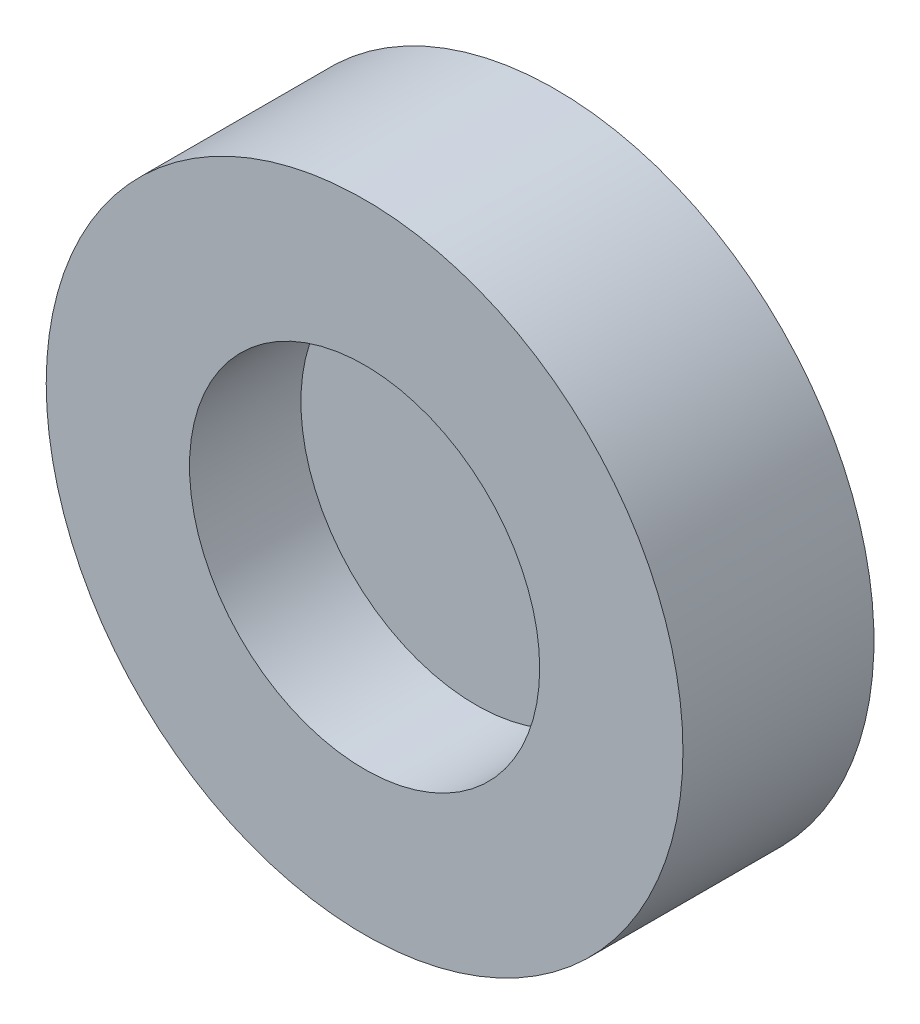
ISO-10303-21;
HEADER;
FILE_DESCRIPTION(('STEP AP214'),'2;1');
FILE_NAME('part.step','',(''),(''),'','','');
FILE_SCHEMA(('AUTOMOTIVE_DESIGN { 1 0 10303 214 1 1 1 1 }'));
ENDSEC;
DATA;
#1=APPLICATION_CONTEXT('core data for automotive mechanical design processes');
#2=APPLICATION_PROTOCOL_DEFINITION('international standard','automotive_design',2000,#1);
#3=PRODUCT_CONTEXT('',#1,'mechanical');
#4=PRODUCT('Part','Part','',(#3));
#5=PRODUCT_RELATED_PRODUCT_CATEGORY('part','',(#4));
#6=PRODUCT_DEFINITION_FORMATION('','',#4);
#7=PRODUCT_DEFINITION_CONTEXT('part definition',#1,'design');
#8=PRODUCT_DEFINITION('design','',#6,#7);
#9=PRODUCT_DEFINITION_SHAPE('','',#8);
#10=(LENGTH_UNIT() NAMED_UNIT(*) SI_UNIT(.MILLI.,.METRE.));
#11=(NAMED_UNIT(*) PLANE_ANGLE_UNIT() SI_UNIT($,.RADIAN.));
#12=(NAMED_UNIT(*) SI_UNIT($,.STERADIAN.) SOLID_ANGLE_UNIT());
#13=UNCERTAINTY_MEASURE_WITH_UNIT(LENGTH_MEASURE(1.E-05),#10,'distance_accuracy_value','');
#14=(GEOMETRIC_REPRESENTATION_CONTEXT(3) GLOBAL_UNCERTAINTY_ASSIGNED_CONTEXT((#13)) GLOBAL_UNIT_ASSIGNED_CONTEXT((#10,
#11,#12)) REPRESENTATION_CONTEXT('',''));
#15=CARTESIAN_POINT('',(0.,0.,0.));
#16=DIRECTION('',(0.,0.,1.));
#17=DIRECTION('',(1.,0.,0.));
#18=AXIS2_PLACEMENT_3D('',#15,#16,#17);
#19=CARTESIAN_POINT('',(0.,0.,7.));
#20=DIRECTION('',(0.,0.,1.));
#21=DIRECTION('',(1.,0.,0.));
#22=AXIS2_PLACEMENT_3D('',#19,#20,#21);
#23=PLANE('',#22);
#24=CARTESIAN_POINT('',(0.,0.,7.));
#25=DIRECTION('',(0.,0.,1.));
#26=DIRECTION('',(1.,0.,0.));
#27=AXIS2_PLACEMENT_3D('',#24,#25,#26);
#28=CIRCLE('',#27,20.);
#29=CARTESIAN_POINT('',(20.,0.,7.));
#30=VERTEX_POINT('',#29);
#31=EDGE_CURVE('E10',#30,#30,#28,.T.);
#32=ORIENTED_EDGE('',*,*,#31,.T.);
#33=EDGE_LOOP('',(#32));
#34=FACE_BOUND('',#33,.T.);
#35=CARTESIAN_POINT('',(0.,0.,7.));
#36=DIRECTION('',(0.,0.,1.));
#37=DIRECTION('',(1.,0.,0.));
#38=AXIS2_PLACEMENT_3D('',#35,#36,#37);
#39=CIRCLE('',#38,11.);
#40=CARTESIAN_POINT('',(11.,0.,7.));
#41=VERTEX_POINT('',#40);
#42=EDGE_CURVE('E45',#41,#41,#39,.T.);
#43=ORIENTED_EDGE('',*,*,#42,.F.);
#44=EDGE_LOOP('',(#43));
#45=FACE_BOUND('',#44,.T.);
#46=ADVANCED_FACE('F37',(#34,#45),#23,.T.);
#47=CARTESIAN_POINT('',(0.,0.,7.));
#48=DIRECTION('',(0.,0.,-1.));
#49=DIRECTION('',(-1.,0.,0.));
#50=AXIS2_PLACEMENT_3D('',#47,#48,#49);
#51=CYLINDRICAL_SURFACE('',#50,20.);
#52=ORIENTED_EDGE('',*,*,#31,.F.);
#53=EDGE_LOOP('',(#52));
#54=FACE_BOUND('',#53,.T.);
#55=CARTESIAN_POINT('',(0.,0.,-5.));
#56=DIRECTION('',(0.,0.,-1.));
#57=DIRECTION('',(-1.,0.,0.));
#58=AXIS2_PLACEMENT_3D('',#55,#56,#57);
#59=CIRCLE('',#58,20.);
#60=CARTESIAN_POINT('',(-20.,0.,-5.));
#61=VERTEX_POINT('',#60);
#62=EDGE_CURVE('E56',#61,#61,#59,.T.);
#63=ORIENTED_EDGE('',*,*,#62,.F.);
#64=EDGE_LOOP('',(#63));
#65=FACE_BOUND('',#64,.T.);
#66=ADVANCED_FACE('F39',(#54,#65),#51,.T.);
#67=CARTESIAN_POINT('',(0.,0.,7.));
#68=DIRECTION('',(0.,0.,-1.));
#69=DIRECTION('',(-1.,0.,0.));
#70=AXIS2_PLACEMENT_3D('',#67,#68,#69);
#71=CYLINDRICAL_SURFACE('',#70,11.);
#72=ORIENTED_EDGE('',*,*,#42,.T.);
#73=EDGE_LOOP('',(#72));
#74=FACE_BOUND('',#73,.T.);
#75=CARTESIAN_POINT('',(0.,0.,0.));
#76=DIRECTION('',(0.,0.,1.));
#77=DIRECTION('',(1.,0.,0.));
#78=AXIS2_PLACEMENT_3D('',#75,#76,#77);
#79=CIRCLE('',#78,11.);
#80=CARTESIAN_POINT('',(11.,0.,0.));
#81=VERTEX_POINT('',#80);
#82=EDGE_CURVE('E50',#81,#81,#79,.T.);
#83=ORIENTED_EDGE('',*,*,#82,.F.);
#84=EDGE_LOOP('',(#83));
#85=FACE_BOUND('',#84,.T.);
#86=ADVANCED_FACE('F65',(#74,#85),#71,.F.);
#87=CARTESIAN_POINT('',(0.,0.,0.));
#88=DIRECTION('',(0.,0.,-1.));
#89=DIRECTION('',(-1.,0.,0.));
#90=AXIS2_PLACEMENT_3D('',#87,#88,#89);
#91=PLANE('',#90);
#92=ORIENTED_EDGE('',*,*,#82,.T.);
#93=EDGE_LOOP('',(#92));
#94=FACE_BOUND('',#93,.T.);
#95=ADVANCED_FACE('F71',(#94),#91,.F.);
#96=CARTESIAN_POINT('',(0.,0.,-5.));
#97=DIRECTION('',(0.,0.,-1.));
#98=DIRECTION('',(-1.,0.,0.));
#99=AXIS2_PLACEMENT_3D('',#96,#97,#98);
#100=PLANE('',#99);
#101=ORIENTED_EDGE('',*,*,#62,.T.);
#102=EDGE_LOOP('',(#101));
#103=FACE_BOUND('',#102,.T.);
#104=ADVANCED_FACE('F62',(#103),#100,.T.);
#105=CLOSED_SHELL('',(#46,#66,#86,#95,#104));
#106=MANIFOLD_SOLID_BREP('B2',#105);
#107=ADVANCED_BREP_SHAPE_REPRESENTATION('',(#18,#106),#14);
#108=SHAPE_DEFINITION_REPRESENTATION(#9,#107);
ENDSEC;
END-ISO-10303-21;
